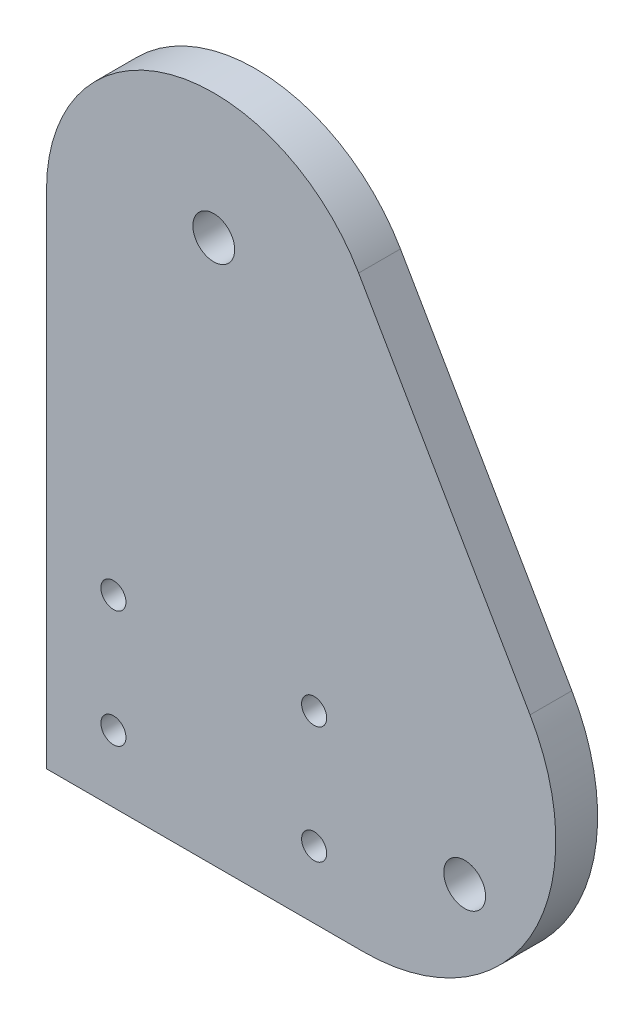
ISO-10303-21;
HEADER;
FILE_DESCRIPTION(('STEP AP214'),'2;1');
FILE_NAME('part.step','',(''),(''),'','','');
FILE_SCHEMA(('AUTOMOTIVE_DESIGN { 1 0 10303 214 1 1 1 1 }'));
ENDSEC;
DATA;
#1=APPLICATION_CONTEXT('core data for automotive mechanical design processes');
#2=APPLICATION_PROTOCOL_DEFINITION('international standard','automotive_design',2000,#1);
#3=PRODUCT_CONTEXT('',#1,'mechanical');
#4=PRODUCT('Part','Part','',(#3));
#5=PRODUCT_RELATED_PRODUCT_CATEGORY('part','',(#4));
#6=PRODUCT_DEFINITION_FORMATION('','',#4);
#7=PRODUCT_DEFINITION_CONTEXT('part definition',#1,'design');
#8=PRODUCT_DEFINITION('design','',#6,#7);
#9=PRODUCT_DEFINITION_SHAPE('','',#8);
#10=(LENGTH_UNIT() NAMED_UNIT(*) SI_UNIT(.MILLI.,.METRE.));
#11=(NAMED_UNIT(*) PLANE_ANGLE_UNIT() SI_UNIT($,.RADIAN.));
#12=(NAMED_UNIT(*) SI_UNIT($,.STERADIAN.) SOLID_ANGLE_UNIT());
#13=UNCERTAINTY_MEASURE_WITH_UNIT(LENGTH_MEASURE(1.E-05),#10,'distance_accuracy_value','');
#14=(GEOMETRIC_REPRESENTATION_CONTEXT(3) GLOBAL_UNCERTAINTY_ASSIGNED_CONTEXT((#13)) GLOBAL_UNIT_ASSIGNED_CONTEXT((#10,
#11,#12)) REPRESENTATION_CONTEXT('',''));
#15=CARTESIAN_POINT('',(0.,0.,0.));
#16=DIRECTION('',(0.,0.,1.));
#17=DIRECTION('',(1.,0.,0.));
#18=AXIS2_PLACEMENT_3D('',#15,#16,#17);
#19=CARTESIAN_POINT('',(0.,-30.,5.));
#20=DIRECTION('',(0.,1.,0.));
#21=DIRECTION('',(0.,0.,1.));
#22=AXIS2_PLACEMENT_3D('',#19,#20,#21);
#23=PLANE('',#22);
#24=DIRECTION('',(1.,0.,0.));
#25=VECTOR('',#24,1.);
#26=CARTESIAN_POINT('',(0.,-30.,0.));
#27=LINE('',#26,#25);
#28=CARTESIAN_POINT('',(-20.,-30.,0.));
#29=VERTEX_POINT('',#28);
#30=CARTESIAN_POINT('',(17.8978583448781,-30.,0.));
#31=VERTEX_POINT('',#30);
#32=EDGE_CURVE('E131',#29,#31,#27,.T.);
#33=ORIENTED_EDGE('',*,*,#32,.T.);
#34=DIRECTION('',(0.,0.,-1.));
#35=VECTOR('',#34,1.);
#36=CARTESIAN_POINT('',(17.8978583448781,-30.,5.));
#37=LINE('',#36,#35);
#38=CARTESIAN_POINT('',(17.8978583448781,-30.,5.));
#39=VERTEX_POINT('',#38);
#40=EDGE_CURVE('E11',#39,#31,#37,.T.);
#41=ORIENTED_EDGE('',*,*,#40,.F.);
#42=DIRECTION('',(1.,0.,0.));
#43=VECTOR('',#42,1.);
#44=CARTESIAN_POINT('',(0.,-30.,5.));
#45=LINE('',#44,#43);
#46=CARTESIAN_POINT('',(-20.,-30.,5.));
#47=VERTEX_POINT('',#46);
#48=EDGE_CURVE('E147',#47,#39,#45,.T.);
#49=ORIENTED_EDGE('',*,*,#48,.F.);
#50=DIRECTION('',(0.,0.,-1.));
#51=VECTOR('',#50,1.);
#52=CARTESIAN_POINT('',(-20.,-30.,5.));
#53=LINE('',#52,#51);
#54=EDGE_CURVE('E109',#47,#29,#53,.T.);
#55=ORIENTED_EDGE('',*,*,#54,.T.);
#56=EDGE_LOOP('',(#33,#41,#49,#55));
#57=FACE_BOUND('',#56,.T.);
#58=ADVANCED_FACE('F38',(#57),#23,.F.);
#59=CARTESIAN_POINT('',(17.8978583448781,-7.,5.));
#60=DIRECTION('',(0.,0.,-1.));
#61=DIRECTION('',(-1.,0.,0.));
#62=AXIS2_PLACEMENT_3D('',#59,#60,#61);
#63=CYLINDRICAL_SURFACE('',#62,23.);
#64=CARTESIAN_POINT('',(17.8978583448781,-7.,0.));
#65=DIRECTION('',(0.,0.,1.));
#66=DIRECTION('',(1.,0.,0.));
#67=AXIS2_PLACEMENT_3D('',#64,#65,#66);
#68=CIRCLE('',#67,23.);
#69=CARTESIAN_POINT('',(37.8164426319203,4.49999999999989,0.));
#70=VERTEX_POINT('',#69);
#71=EDGE_CURVE('E134',#31,#70,#68,.T.);
#72=ORIENTED_EDGE('',*,*,#71,.T.);
#73=DIRECTION('',(0.,0.,-1.));
#74=VECTOR('',#73,1.);
#75=CARTESIAN_POINT('',(37.8164426319203,4.49999999999989,5.));
#76=LINE('',#75,#74);
#77=CARTESIAN_POINT('',(37.8164426319203,4.49999999999989,5.));
#78=VERTEX_POINT('',#77);
#79=EDGE_CURVE('E47',#78,#70,#76,.T.);
#80=ORIENTED_EDGE('',*,*,#79,.F.);
#81=CARTESIAN_POINT('',(17.8978583448781,-7.,5.));
#82=DIRECTION('',(0.,0.,1.));
#83=DIRECTION('',(1.,0.,0.));
#84=AXIS2_PLACEMENT_3D('',#81,#82,#83);
#85=CIRCLE('',#84,23.);
#86=EDGE_CURVE('E89',#39,#78,#85,.T.);
#87=ORIENTED_EDGE('',*,*,#86,.F.);
#88=ORIENTED_EDGE('',*,*,#40,.T.);
#89=EDGE_LOOP('',(#72,#80,#87,#88));
#90=FACE_BOUND('',#89,.T.);
#91=ADVANCED_FACE('F162',(#90),#63,.T.);
#92=CARTESIAN_POINT('',(30.3108891324553,17.4999999999998,5.));
#93=DIRECTION('',(-0.866025403784442,-0.499999999999995,0.));
#94=DIRECTION('',(0.499999999999995,-0.866025403784442,0.));
#95=AXIS2_PLACEMENT_3D('',#92,#93,#94);
#96=PLANE('',#95);
#97=DIRECTION('',(-0.499999999999995,0.866025403784442,0.));
#98=VECTOR('',#97,1.);
#99=CARTESIAN_POINT('',(30.3108891324553,17.4999999999998,0.));
#100=LINE('',#99,#98);
#101=CARTESIAN_POINT('',(17.3205080756888,39.9999999999999,0.));
#102=VERTEX_POINT('',#101);
#103=EDGE_CURVE('E104',#70,#102,#100,.T.);
#104=ORIENTED_EDGE('',*,*,#103,.T.);
#105=DIRECTION('',(0.,0.,-1.));
#106=VECTOR('',#105,1.);
#107=CARTESIAN_POINT('',(17.3205080756888,39.9999999999999,5.));
#108=LINE('',#107,#106);
#109=CARTESIAN_POINT('',(17.3205080756888,39.9999999999999,5.));
#110=VERTEX_POINT('',#109);
#111=EDGE_CURVE('E101',#110,#102,#108,.T.);
#112=ORIENTED_EDGE('',*,*,#111,.F.);
#113=DIRECTION('',(-0.499999999999995,0.866025403784442,0.));
#114=VECTOR('',#113,1.);
#115=CARTESIAN_POINT('',(30.3108891324553,17.4999999999998,5.));
#116=LINE('',#115,#114);
#117=EDGE_CURVE('E93',#78,#110,#116,.T.);
#118=ORIENTED_EDGE('',*,*,#117,.F.);
#119=ORIENTED_EDGE('',*,*,#79,.T.);
#120=EDGE_LOOP('',(#104,#112,#118,#119));
#121=FACE_BOUND('',#120,.T.);
#122=ADVANCED_FACE('F102',(#121),#96,.F.);
#123=CARTESIAN_POINT('',(0.,30.,5.));
#124=DIRECTION('',(0.,0.,-1.));
#125=DIRECTION('',(-1.,0.,0.));
#126=AXIS2_PLACEMENT_3D('',#123,#124,#125);
#127=CYLINDRICAL_SURFACE('',#126,20.);
#128=CARTESIAN_POINT('',(0.,30.,0.));
#129=DIRECTION('',(0.,0.,1.));
#130=DIRECTION('',(1.,0.,0.));
#131=AXIS2_PLACEMENT_3D('',#128,#129,#130);
#132=CIRCLE('',#131,20.);
#133=CARTESIAN_POINT('',(-20.,30.,0.));
#134=VERTEX_POINT('',#133);
#135=EDGE_CURVE('E75',#102,#134,#132,.T.);
#136=ORIENTED_EDGE('',*,*,#135,.T.);
#137=DIRECTION('',(0.,0.,-1.));
#138=VECTOR('',#137,1.);
#139=CARTESIAN_POINT('',(-20.,30.,5.));
#140=LINE('',#139,#138);
#141=CARTESIAN_POINT('',(-20.,30.,5.));
#142=VERTEX_POINT('',#141);
#143=EDGE_CURVE('E105',#142,#134,#140,.T.);
#144=ORIENTED_EDGE('',*,*,#143,.F.);
#145=CARTESIAN_POINT('',(0.,30.,5.));
#146=DIRECTION('',(0.,0.,1.));
#147=DIRECTION('',(1.,0.,0.));
#148=AXIS2_PLACEMENT_3D('',#145,#146,#147);
#149=CIRCLE('',#148,20.);
#150=EDGE_CURVE('E97',#110,#142,#149,.T.);
#151=ORIENTED_EDGE('',*,*,#150,.F.);
#152=ORIENTED_EDGE('',*,*,#111,.T.);
#153=EDGE_LOOP('',(#136,#144,#151,#152));
#154=FACE_BOUND('',#153,.T.);
#155=ADVANCED_FACE('F107',(#154),#127,.T.);
#156=CARTESIAN_POINT('',(29.9999999999997,-16.9615242270665,5.));
#157=DIRECTION('',(0.,0.,-1.));
#158=DIRECTION('',(-1.,0.,0.));
#159=AXIS2_PLACEMENT_3D('',#156,#157,#158);
#160=CYLINDRICAL_SURFACE('',#159,2.5);
#161=CARTESIAN_POINT('',(29.9999999999997,-16.9615242270665,5.));
#162=DIRECTION('',(0.,0.,1.));
#163=DIRECTION('',(1.,0.,0.));
#164=AXIS2_PLACEMENT_3D('',#161,#162,#163);
#165=CIRCLE('',#164,2.5);
#166=CARTESIAN_POINT('',(32.4999999999997,-16.9615242270665,5.));
#167=VERTEX_POINT('',#166);
#168=EDGE_CURVE('E299',#167,#167,#165,.T.);
#169=ORIENTED_EDGE('',*,*,#168,.T.);
#170=EDGE_LOOP('',(#169));
#171=FACE_BOUND('',#170,.T.);
#172=CARTESIAN_POINT('',(29.9999999999997,-16.9615242270665,0.));
#173=DIRECTION('',(0.,0.,1.));
#174=DIRECTION('',(1.,0.,0.));
#175=AXIS2_PLACEMENT_3D('',#172,#173,#174);
#176=CIRCLE('',#175,2.5);
#177=CARTESIAN_POINT('',(32.4999999999997,-16.9615242270665,0.));
#178=VERTEX_POINT('',#177);
#179=EDGE_CURVE('E128',#178,#178,#176,.T.);
#180=ORIENTED_EDGE('',*,*,#179,.F.);
#181=EDGE_LOOP('',(#180));
#182=FACE_BOUND('',#181,.T.);
#183=ADVANCED_FACE('F170',(#171,#182),#160,.F.);
#184=CARTESIAN_POINT('',(0.,35.,5.));
#185=DIRECTION('',(0.,0.,-1.));
#186=DIRECTION('',(-1.,0.,0.));
#187=AXIS2_PLACEMENT_3D('',#184,#185,#186);
#188=CYLINDRICAL_SURFACE('',#187,2.5);
#189=CARTESIAN_POINT('',(0.,35.,5.));
#190=DIRECTION('',(0.,0.,1.));
#191=DIRECTION('',(1.,0.,0.));
#192=AXIS2_PLACEMENT_3D('',#189,#190,#191);
#193=CIRCLE('',#192,2.5);
#194=CARTESIAN_POINT('',(2.5,35.,5.));
#195=VERTEX_POINT('',#194);
#196=EDGE_CURVE('E296',#195,#195,#193,.T.);
#197=ORIENTED_EDGE('',*,*,#196,.T.);
#198=EDGE_LOOP('',(#197));
#199=FACE_BOUND('',#198,.T.);
#200=CARTESIAN_POINT('',(0.,35.,0.));
#201=DIRECTION('',(0.,0.,1.));
#202=DIRECTION('',(1.,0.,0.));
#203=AXIS2_PLACEMENT_3D('',#200,#201,#202);
#204=CIRCLE('',#203,2.5);
#205=CARTESIAN_POINT('',(2.5,35.,0.));
#206=VERTEX_POINT('',#205);
#207=EDGE_CURVE('E125',#206,#206,#204,.T.);
#208=ORIENTED_EDGE('',*,*,#207,.F.);
#209=EDGE_LOOP('',(#208));
#210=FACE_BOUND('',#209,.T.);
#211=ADVANCED_FACE('F173',(#199,#210),#188,.F.);
#212=CARTESIAN_POINT('',(12.,-22.,5.));
#213=DIRECTION('',(0.,0.,-1.));
#214=DIRECTION('',(-1.,0.,0.));
#215=AXIS2_PLACEMENT_3D('',#212,#213,#214);
#216=CYLINDRICAL_SURFACE('',#215,1.5);
#217=CARTESIAN_POINT('',(12.,-22.,5.));
#218=DIRECTION('',(0.,0.,1.));
#219=DIRECTION('',(1.,0.,0.));
#220=AXIS2_PLACEMENT_3D('',#217,#218,#219);
#221=CIRCLE('',#220,1.5);
#222=CARTESIAN_POINT('',(13.5,-22.,5.));
#223=VERTEX_POINT('',#222);
#224=EDGE_CURVE('E289',#223,#223,#221,.F.);
#225=ORIENTED_EDGE('',*,*,#224,.F.);
#226=EDGE_LOOP('',(#225));
#227=FACE_BOUND('',#226,.T.);
#228=CARTESIAN_POINT('',(12.,-22.,0.));
#229=DIRECTION('',(0.,0.,1.));
#230=DIRECTION('',(1.,0.,0.));
#231=AXIS2_PLACEMENT_3D('',#228,#229,#230);
#232=CIRCLE('',#231,1.5);
#233=CARTESIAN_POINT('',(13.5,-22.,0.));
#234=VERTEX_POINT('',#233);
#235=EDGE_CURVE('E122',#234,#234,#232,.F.);
#236=ORIENTED_EDGE('',*,*,#235,.T.);
#237=EDGE_LOOP('',(#236));
#238=FACE_BOUND('',#237,.T.);
#239=ADVANCED_FACE('F177',(#227,#238),#216,.F.);
#240=CARTESIAN_POINT('',(-12.,-22.,5.));
#241=DIRECTION('',(0.,0.,-1.));
#242=DIRECTION('',(-1.,0.,0.));
#243=AXIS2_PLACEMENT_3D('',#240,#241,#242);
#244=CYLINDRICAL_SURFACE('',#243,1.5);
#245=CARTESIAN_POINT('',(-12.,-22.,5.));
#246=DIRECTION('',(0.,0.,1.));
#247=DIRECTION('',(1.,0.,0.));
#248=AXIS2_PLACEMENT_3D('',#245,#246,#247);
#249=CIRCLE('',#248,1.5);
#250=CARTESIAN_POINT('',(-10.5,-22.,5.));
#251=VERTEX_POINT('',#250);
#252=EDGE_CURVE('E286',#251,#251,#249,.T.);
#253=ORIENTED_EDGE('',*,*,#252,.T.);
#254=EDGE_LOOP('',(#253));
#255=FACE_BOUND('',#254,.T.);
#256=CARTESIAN_POINT('',(-12.,-22.,0.));
#257=DIRECTION('',(0.,0.,1.));
#258=DIRECTION('',(1.,0.,0.));
#259=AXIS2_PLACEMENT_3D('',#256,#257,#258);
#260=CIRCLE('',#259,1.5);
#261=CARTESIAN_POINT('',(-10.5,-22.,0.));
#262=VERTEX_POINT('',#261);
#263=EDGE_CURVE('E119',#262,#262,#260,.T.);
#264=ORIENTED_EDGE('',*,*,#263,.F.);
#265=EDGE_LOOP('',(#264));
#266=FACE_BOUND('',#265,.T.);
#267=ADVANCED_FACE('F181',(#255,#266),#244,.F.);
#268=CARTESIAN_POINT('',(-12.,-8.,5.));
#269=DIRECTION('',(0.,0.,-1.));
#270=DIRECTION('',(-1.,0.,0.));
#271=AXIS2_PLACEMENT_3D('',#268,#269,#270);
#272=CYLINDRICAL_SURFACE('',#271,1.5);
#273=CARTESIAN_POINT('',(-12.,-8.,5.));
#274=DIRECTION('',(0.,0.,1.));
#275=DIRECTION('',(1.,0.,0.));
#276=AXIS2_PLACEMENT_3D('',#273,#274,#275);
#277=CIRCLE('',#276,1.5);
#278=CARTESIAN_POINT('',(-10.5,-8.,5.));
#279=VERTEX_POINT('',#278);
#280=EDGE_CURVE('E192',#279,#279,#277,.T.);
#281=ORIENTED_EDGE('',*,*,#280,.T.);
#282=EDGE_LOOP('',(#281));
#283=FACE_BOUND('',#282,.T.);
#284=CARTESIAN_POINT('',(-12.,-8.,0.));
#285=DIRECTION('',(0.,0.,1.));
#286=DIRECTION('',(1.,0.,0.));
#287=AXIS2_PLACEMENT_3D('',#284,#285,#286);
#288=CIRCLE('',#287,1.5);
#289=CARTESIAN_POINT('',(-10.5,-8.,0.));
#290=VERTEX_POINT('',#289);
#291=EDGE_CURVE('E116',#290,#290,#288,.T.);
#292=ORIENTED_EDGE('',*,*,#291,.F.);
#293=EDGE_LOOP('',(#292));
#294=FACE_BOUND('',#293,.T.);
#295=ADVANCED_FACE('F157',(#283,#294),#272,.F.);
#296=CARTESIAN_POINT('',(12.,-8.,5.));
#297=DIRECTION('',(0.,0.,-1.));
#298=DIRECTION('',(-1.,0.,0.));
#299=AXIS2_PLACEMENT_3D('',#296,#297,#298);
#300=CYLINDRICAL_SURFACE('',#299,1.5);
#301=CARTESIAN_POINT('',(12.,-8.,5.));
#302=DIRECTION('',(0.,0.,1.));
#303=DIRECTION('',(1.,0.,0.));
#304=AXIS2_PLACEMENT_3D('',#301,#302,#303);
#305=CIRCLE('',#304,1.5);
#306=CARTESIAN_POINT('',(13.5,-8.,5.));
#307=VERTEX_POINT('',#306);
#308=EDGE_CURVE('E139',#307,#307,#305,.F.);
#309=ORIENTED_EDGE('',*,*,#308,.F.);
#310=EDGE_LOOP('',(#309));
#311=FACE_BOUND('',#310,.T.);
#312=CARTESIAN_POINT('',(12.,-8.,0.));
#313=DIRECTION('',(0.,0.,1.));
#314=DIRECTION('',(1.,0.,0.));
#315=AXIS2_PLACEMENT_3D('',#312,#313,#314);
#316=CIRCLE('',#315,1.5);
#317=CARTESIAN_POINT('',(13.5,-8.,0.));
#318=VERTEX_POINT('',#317);
#319=EDGE_CURVE('E113',#318,#318,#316,.F.);
#320=ORIENTED_EDGE('',*,*,#319,.T.);
#321=EDGE_LOOP('',(#320));
#322=FACE_BOUND('',#321,.T.);
#323=ADVANCED_FACE('F40',(#311,#322),#300,.F.);
#324=CARTESIAN_POINT('',(-20.,0.,5.));
#325=DIRECTION('',(1.,0.,0.));
#326=DIRECTION('',(0.,0.,-1.));
#327=AXIS2_PLACEMENT_3D('',#324,#325,#326);
#328=PLANE('',#327);
#329=DIRECTION('',(0.,-1.,0.));
#330=VECTOR('',#329,1.);
#331=CARTESIAN_POINT('',(-20.,0.,0.));
#332=LINE('',#331,#330);
#333=EDGE_CURVE('E81',#134,#29,#332,.T.);
#334=ORIENTED_EDGE('',*,*,#333,.T.);
#335=ORIENTED_EDGE('',*,*,#54,.F.);
#336=DIRECTION('',(0.,-1.,0.));
#337=VECTOR('',#336,1.);
#338=CARTESIAN_POINT('',(-20.,0.,5.));
#339=LINE('',#338,#337);
#340=EDGE_CURVE('E55',#142,#47,#339,.T.);
#341=ORIENTED_EDGE('',*,*,#340,.F.);
#342=ORIENTED_EDGE('',*,*,#143,.T.);
#343=EDGE_LOOP('',(#334,#335,#341,#342));
#344=FACE_BOUND('',#343,.T.);
#345=ADVANCED_FACE('F148',(#344),#328,.F.);
#346=CARTESIAN_POINT('',(0.,0.,5.));
#347=DIRECTION('',(0.,0.,1.));
#348=DIRECTION('',(1.,0.,0.));
#349=AXIS2_PLACEMENT_3D('',#346,#347,#348);
#350=PLANE('',#349);
#351=ORIENTED_EDGE('',*,*,#308,.T.);
#352=EDGE_LOOP('',(#351));
#353=FACE_BOUND('',#352,.T.);
#354=ORIENTED_EDGE('',*,*,#280,.F.);
#355=EDGE_LOOP('',(#354));
#356=FACE_BOUND('',#355,.T.);
#357=ORIENTED_EDGE('',*,*,#252,.F.);
#358=EDGE_LOOP('',(#357));
#359=FACE_BOUND('',#358,.T.);
#360=ORIENTED_EDGE('',*,*,#224,.T.);
#361=EDGE_LOOP('',(#360));
#362=FACE_BOUND('',#361,.T.);
#363=ORIENTED_EDGE('',*,*,#196,.F.);
#364=EDGE_LOOP('',(#363));
#365=FACE_BOUND('',#364,.T.);
#366=ORIENTED_EDGE('',*,*,#168,.F.);
#367=EDGE_LOOP('',(#366));
#368=FACE_BOUND('',#367,.T.);
#369=ORIENTED_EDGE('',*,*,#48,.T.);
#370=ORIENTED_EDGE('',*,*,#86,.T.);
#371=ORIENTED_EDGE('',*,*,#117,.T.);
#372=ORIENTED_EDGE('',*,*,#150,.T.);
#373=ORIENTED_EDGE('',*,*,#340,.T.);
#374=EDGE_LOOP('',(#369,#370,#371,#372,#373));
#375=FACE_BOUND('',#374,.T.);
#376=ADVANCED_FACE('F95',(#353,#356,#359,#362,#365,#368,#375),#350,.T.);
#377=CARTESIAN_POINT('',(0.,0.,0.));
#378=DIRECTION('',(0.,0.,1.));
#379=DIRECTION('',(1.,0.,0.));
#380=AXIS2_PLACEMENT_3D('',#377,#378,#379);
#381=PLANE('',#380);
#382=ORIENTED_EDGE('',*,*,#319,.F.);
#383=EDGE_LOOP('',(#382));
#384=FACE_BOUND('',#383,.T.);
#385=ORIENTED_EDGE('',*,*,#291,.T.);
#386=EDGE_LOOP('',(#385));
#387=FACE_BOUND('',#386,.T.);
#388=ORIENTED_EDGE('',*,*,#263,.T.);
#389=EDGE_LOOP('',(#388));
#390=FACE_BOUND('',#389,.T.);
#391=ORIENTED_EDGE('',*,*,#235,.F.);
#392=EDGE_LOOP('',(#391));
#393=FACE_BOUND('',#392,.T.);
#394=ORIENTED_EDGE('',*,*,#207,.T.);
#395=EDGE_LOOP('',(#394));
#396=FACE_BOUND('',#395,.T.);
#397=ORIENTED_EDGE('',*,*,#179,.T.);
#398=EDGE_LOOP('',(#397));
#399=FACE_BOUND('',#398,.T.);
#400=ORIENTED_EDGE('',*,*,#32,.F.);
#401=ORIENTED_EDGE('',*,*,#333,.F.);
#402=ORIENTED_EDGE('',*,*,#135,.F.);
#403=ORIENTED_EDGE('',*,*,#103,.F.);
#404=ORIENTED_EDGE('',*,*,#71,.F.);
#405=EDGE_LOOP('',(#400,#401,#402,#403,#404));
#406=FACE_BOUND('',#405,.T.);
#407=ADVANCED_FACE('F143',(#384,#387,#390,#393,#396,#399,#406),#381,.F.);
#408=CLOSED_SHELL('',(#58,#91,#122,#155,#183,#211,#239,#267,#295,#323,#345,#376,#407));
#409=MANIFOLD_SOLID_BREP('B2',#408);
#410=ADVANCED_BREP_SHAPE_REPRESENTATION('',(#18,#409),#14);
#411=SHAPE_DEFINITION_REPRESENTATION(#9,#410);
ENDSEC;
END-ISO-10303-21;
